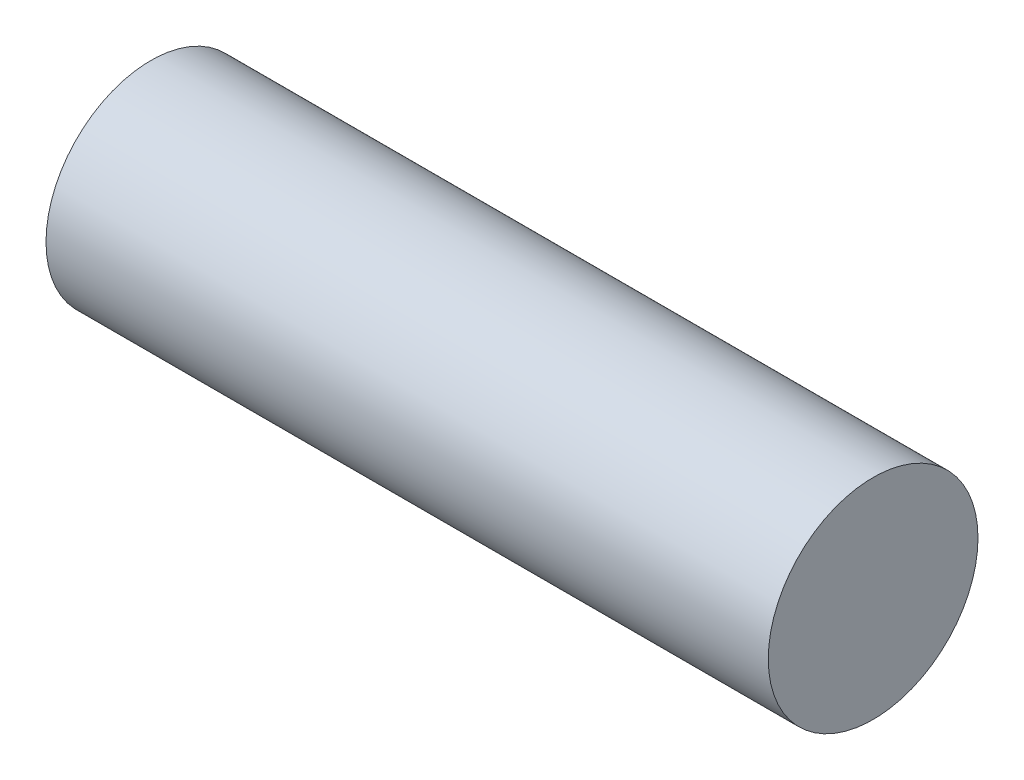
ISO-10303-21;
HEADER;
FILE_DESCRIPTION(('STEP AP214'),'2;1');
FILE_NAME('part.step','',(''),(''),'','','');
FILE_SCHEMA(('AUTOMOTIVE_DESIGN { 1 0 10303 214 1 1 1 1 }'));
ENDSEC;
DATA;
#1=APPLICATION_CONTEXT('core data for automotive mechanical design processes');
#2=APPLICATION_PROTOCOL_DEFINITION('international standard','automotive_design',2000,#1);
#3=PRODUCT_CONTEXT('',#1,'mechanical');
#4=PRODUCT('Part','Part','',(#3));
#5=PRODUCT_RELATED_PRODUCT_CATEGORY('part','',(#4));
#6=PRODUCT_DEFINITION_FORMATION('','',#4);
#7=PRODUCT_DEFINITION_CONTEXT('part definition',#1,'design');
#8=PRODUCT_DEFINITION('design','',#6,#7);
#9=PRODUCT_DEFINITION_SHAPE('','',#8);
#10=(LENGTH_UNIT() NAMED_UNIT(*) SI_UNIT(.MILLI.,.METRE.));
#11=(NAMED_UNIT(*) PLANE_ANGLE_UNIT() SI_UNIT($,.RADIAN.));
#12=(NAMED_UNIT(*) SI_UNIT($,.STERADIAN.) SOLID_ANGLE_UNIT());
#13=UNCERTAINTY_MEASURE_WITH_UNIT(LENGTH_MEASURE(1.E-05),#10,'distance_accuracy_value','');
#14=(GEOMETRIC_REPRESENTATION_CONTEXT(3) GLOBAL_UNCERTAINTY_ASSIGNED_CONTEXT((#13)) GLOBAL_UNIT_ASSIGNED_CONTEXT((#10,
#11,#12)) REPRESENTATION_CONTEXT('',''));
#15=CARTESIAN_POINT('',(0.,0.,0.));
#16=DIRECTION('',(0.,0.,1.));
#17=DIRECTION('',(1.,0.,0.));
#18=AXIS2_PLACEMENT_3D('',#15,#16,#17);
#19=CARTESIAN_POINT('',(27.55,0.,0.));
#20=DIRECTION('',(-1.,0.,0.));
#21=DIRECTION('',(0.,0.,1.));
#22=AXIS2_PLACEMENT_3D('',#19,#20,#21);
#23=CYLINDRICAL_SURFACE('',#22,4.);
#24=CARTESIAN_POINT('',(27.55,0.,0.));
#25=DIRECTION('',(1.,0.,0.));
#26=DIRECTION('',(0.,0.,-1.));
#27=AXIS2_PLACEMENT_3D('',#24,#25,#26);
#28=CIRCLE('',#27,4.);
#29=CARTESIAN_POINT('',(27.55,0.,-4.));
#30=VERTEX_POINT('',#29);
#31=EDGE_CURVE('E10',#30,#30,#28,.T.);
#32=ORIENTED_EDGE('',*,*,#31,.F.);
#33=EDGE_LOOP('',(#32));
#34=FACE_BOUND('',#33,.T.);
#35=CARTESIAN_POINT('',(0.,0.,0.));
#36=DIRECTION('',(1.,0.,0.));
#37=DIRECTION('',(0.,0.,-1.));
#38=AXIS2_PLACEMENT_3D('',#35,#36,#37);
#39=CIRCLE('',#38,4.);
#40=CARTESIAN_POINT('',(0.,0.,-4.));
#41=VERTEX_POINT('',#40);
#42=EDGE_CURVE('E40',#41,#41,#39,.T.);
#43=ORIENTED_EDGE('',*,*,#42,.T.);
#44=EDGE_LOOP('',(#43));
#45=FACE_BOUND('',#44,.T.);
#46=ADVANCED_FACE('F37',(#34,#45),#23,.T.);
#47=CARTESIAN_POINT('',(27.55,0.,0.));
#48=DIRECTION('',(1.,0.,0.));
#49=DIRECTION('',(0.,0.,-1.));
#50=AXIS2_PLACEMENT_3D('',#47,#48,#49);
#51=PLANE('',#50);
#52=ORIENTED_EDGE('',*,*,#31,.T.);
#53=EDGE_LOOP('',(#52));
#54=FACE_BOUND('',#53,.T.);
#55=ADVANCED_FACE('F52',(#54),#51,.T.);
#56=CARTESIAN_POINT('',(0.,0.,0.));
#57=DIRECTION('',(1.,0.,0.));
#58=DIRECTION('',(0.,0.,-1.));
#59=AXIS2_PLACEMENT_3D('',#56,#57,#58);
#60=PLANE('',#59);
#61=ORIENTED_EDGE('',*,*,#42,.F.);
#62=EDGE_LOOP('',(#61));
#63=FACE_BOUND('',#62,.T.);
#64=ADVANCED_FACE('F50',(#63),#60,.F.);
#65=CLOSED_SHELL('',(#46,#55,#64));
#66=MANIFOLD_SOLID_BREP('B2',#65);
#67=ADVANCED_BREP_SHAPE_REPRESENTATION('',(#18,#66),#14);
#68=SHAPE_DEFINITION_REPRESENTATION(#9,#67);
ENDSEC;
END-ISO-10303-21;
